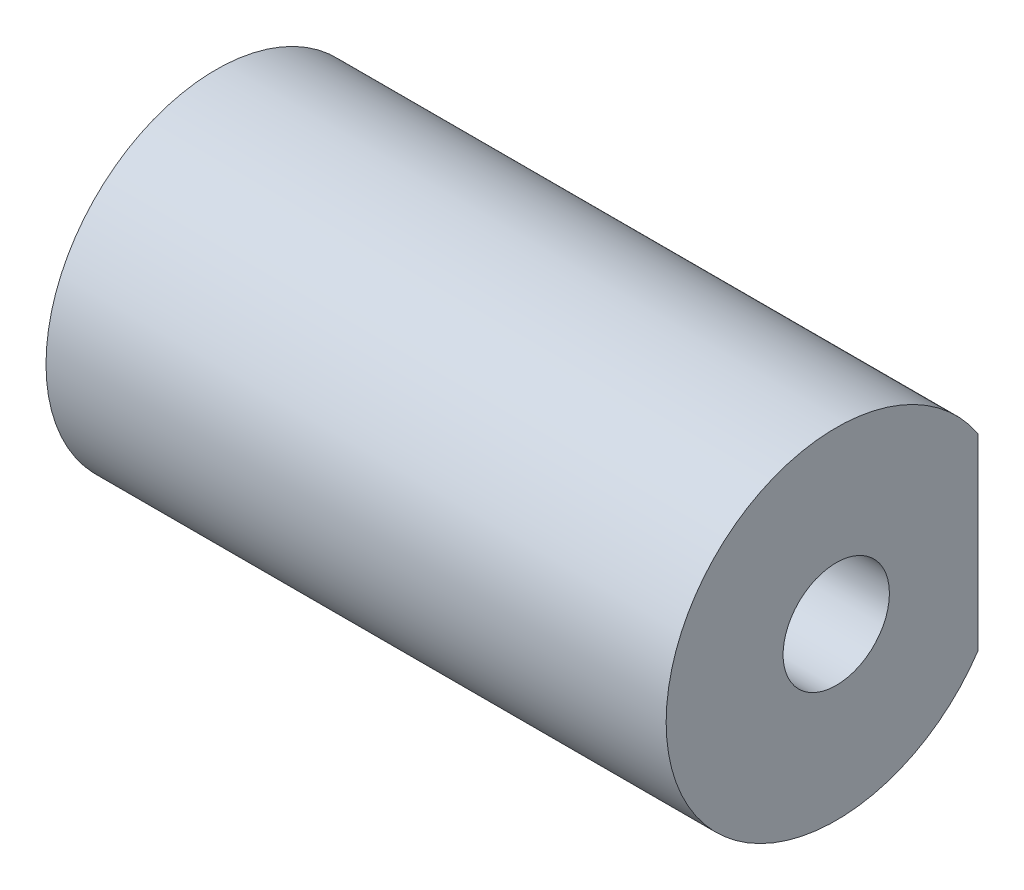
ISO-10303-21;
HEADER;
FILE_DESCRIPTION(('STEP AP214'),'2;1');
FILE_NAME('part.step','',(''),(''),'','','');
FILE_SCHEMA(('AUTOMOTIVE_DESIGN { 1 0 10303 214 1 1 1 1 }'));
ENDSEC;
DATA;
#1=APPLICATION_CONTEXT('core data for automotive mechanical design processes');
#2=APPLICATION_PROTOCOL_DEFINITION('international standard','automotive_design',2000,#1);
#3=PRODUCT_CONTEXT('',#1,'mechanical');
#4=PRODUCT('Part','Part','',(#3));
#5=PRODUCT_RELATED_PRODUCT_CATEGORY('part','',(#4));
#6=PRODUCT_DEFINITION_FORMATION('','',#4);
#7=PRODUCT_DEFINITION_CONTEXT('part definition',#1,'design');
#8=PRODUCT_DEFINITION('design','',#6,#7);
#9=PRODUCT_DEFINITION_SHAPE('','',#8);
#10=(LENGTH_UNIT() NAMED_UNIT(*) SI_UNIT(.MILLI.,.METRE.));
#11=(NAMED_UNIT(*) PLANE_ANGLE_UNIT() SI_UNIT($,.RADIAN.));
#12=(NAMED_UNIT(*) SI_UNIT($,.STERADIAN.) SOLID_ANGLE_UNIT());
#13=UNCERTAINTY_MEASURE_WITH_UNIT(LENGTH_MEASURE(1.E-05),#10,'distance_accuracy_value','');
#14=(GEOMETRIC_REPRESENTATION_CONTEXT(3) GLOBAL_UNCERTAINTY_ASSIGNED_CONTEXT((#13)) GLOBAL_UNIT_ASSIGNED_CONTEXT((#10,
#11,#12)) REPRESENTATION_CONTEXT('',''));
#15=CARTESIAN_POINT('',(0.,0.,0.));
#16=DIRECTION('',(0.,0.,1.));
#17=DIRECTION('',(1.,0.,0.));
#18=AXIS2_PLACEMENT_3D('',#15,#16,#17);
#19=CARTESIAN_POINT('',(17.5,0.,0.));
#20=DIRECTION('',(1.,0.,0.));
#21=DIRECTION('',(0.,0.,-1.));
#22=AXIS2_PLACEMENT_3D('',#19,#20,#21);
#23=PLANE('',#22);
#24=DIRECTION('',(0.,-1.,0.));
#25=VECTOR('',#24,1.);
#26=CARTESIAN_POINT('',(17.5,7.17405726897624,-4.));
#27=LINE('',#26,#25);
#28=CARTESIAN_POINT('',(17.5,2.65329983228432,-4.));
#29=VERTEX_POINT('',#28);
#30=CARTESIAN_POINT('',(17.5,-2.65329983228432,-4.));
#31=VERTEX_POINT('',#30);
#32=EDGE_CURVE('E48',#29,#31,#27,.T.);
#33=ORIENTED_EDGE('',*,*,#32,.F.);
#34=CARTESIAN_POINT('',(17.5,0.,0.));
#35=DIRECTION('',(1.,0.,0.));
#36=DIRECTION('',(0.,0.,-1.));
#37=AXIS2_PLACEMENT_3D('',#34,#35,#36);
#38=CIRCLE('',#37,4.8);
#39=EDGE_CURVE('E65',#29,#31,#38,.T.);
#40=ORIENTED_EDGE('',*,*,#39,.T.);
#41=EDGE_LOOP('',(#33,#40));
#42=FACE_BOUND('',#41,.T.);
#43=CARTESIAN_POINT('',(17.5,0.,0.));
#44=DIRECTION('',(1.,0.,0.));
#45=DIRECTION('',(0.,0.,-1.));
#46=AXIS2_PLACEMENT_3D('',#43,#44,#45);
#47=CIRCLE('',#46,1.5);
#48=CARTESIAN_POINT('',(17.5,0.,-1.5));
#49=VERTEX_POINT('',#48);
#50=EDGE_CURVE('E69',#49,#49,#47,.T.);
#51=ORIENTED_EDGE('',*,*,#50,.F.);
#52=EDGE_LOOP('',(#51));
#53=FACE_BOUND('',#52,.T.);
#54=ADVANCED_FACE('F33',(#42,#53),#23,.T.);
#55=CARTESIAN_POINT('',(0.,0.,0.));
#56=DIRECTION('',(1.,0.,0.));
#57=DIRECTION('',(0.,0.,-1.));
#58=AXIS2_PLACEMENT_3D('',#55,#56,#57);
#59=PLANE('',#58);
#60=CARTESIAN_POINT('',(0.,0.,0.));
#61=DIRECTION('',(1.,0.,0.));
#62=DIRECTION('',(0.,0.,-1.));
#63=AXIS2_PLACEMENT_3D('',#60,#61,#62);
#64=CIRCLE('',#63,4.8);
#65=CARTESIAN_POINT('',(0.,2.65329983228432,-4.));
#66=VERTEX_POINT('',#65);
#67=CARTESIAN_POINT('',(0.,-2.65329983228432,-4.));
#68=VERTEX_POINT('',#67);
#69=EDGE_CURVE('E67',#66,#68,#64,.T.);
#70=ORIENTED_EDGE('',*,*,#69,.F.);
#71=DIRECTION('',(0.,-1.,0.));
#72=VECTOR('',#71,1.);
#73=CARTESIAN_POINT('',(0.,7.17405726897624,-4.));
#74=LINE('',#73,#72);
#75=EDGE_CURVE('E57',#66,#68,#74,.T.);
#76=ORIENTED_EDGE('',*,*,#75,.T.);
#77=EDGE_LOOP('',(#70,#76));
#78=FACE_BOUND('',#77,.T.);
#79=CARTESIAN_POINT('',(0.,0.,0.));
#80=DIRECTION('',(1.,0.,0.));
#81=DIRECTION('',(0.,0.,-1.));
#82=AXIS2_PLACEMENT_3D('',#79,#80,#81);
#83=CIRCLE('',#82,1.5);
#84=CARTESIAN_POINT('',(0.,0.,-1.5));
#85=VERTEX_POINT('',#84);
#86=EDGE_CURVE('E72',#85,#85,#83,.T.);
#87=ORIENTED_EDGE('',*,*,#86,.T.);
#88=EDGE_LOOP('',(#87));
#89=FACE_BOUND('',#88,.T.);
#90=ADVANCED_FACE('F78',(#78,#89),#59,.F.);
#91=CARTESIAN_POINT('',(17.5,0.,0.));
#92=DIRECTION('',(-1.,0.,0.));
#93=DIRECTION('',(0.,0.,1.));
#94=AXIS2_PLACEMENT_3D('',#91,#92,#93);
#95=CYLINDRICAL_SURFACE('',#94,4.8);
#96=ORIENTED_EDGE('',*,*,#39,.F.);
#97=DIRECTION('',(-1.,0.,0.));
#98=VECTOR('',#97,1.);
#99=CARTESIAN_POINT('',(17.5,2.65329983228432,-4.));
#100=LINE('',#99,#98);
#101=EDGE_CURVE('E11',#29,#66,#100,.T.);
#102=ORIENTED_EDGE('',*,*,#101,.T.);
#103=ORIENTED_EDGE('',*,*,#69,.T.);
#104=DIRECTION('',(-1.,0.,0.));
#105=VECTOR('',#104,1.);
#106=CARTESIAN_POINT('',(17.5,-2.65329983228432,-4.));
#107=LINE('',#106,#105);
#108=EDGE_CURVE('E41',#68,#31,#107,.F.);
#109=ORIENTED_EDGE('',*,*,#108,.T.);
#110=EDGE_LOOP('',(#96,#102,#103,#109));
#111=FACE_BOUND('',#110,.T.);
#112=ADVANCED_FACE('F35',(#111),#95,.T.);
#113=CARTESIAN_POINT('',(17.5,0.,0.));
#114=DIRECTION('',(-1.,0.,0.));
#115=DIRECTION('',(0.,0.,1.));
#116=AXIS2_PLACEMENT_3D('',#113,#114,#115);
#117=CYLINDRICAL_SURFACE('',#116,1.5);
#118=ORIENTED_EDGE('',*,*,#50,.T.);
#119=EDGE_LOOP('',(#118));
#120=FACE_BOUND('',#119,.T.);
#121=ORIENTED_EDGE('',*,*,#86,.F.);
#122=EDGE_LOOP('',(#121));
#123=FACE_BOUND('',#122,.T.);
#124=ADVANCED_FACE('F83',(#120,#123),#117,.F.);
#125=CARTESIAN_POINT('',(0.,7.17405726897624,-4.));
#126=DIRECTION('',(0.,0.,1.));
#127=DIRECTION('',(0.,-1.,0.));
#128=AXIS2_PLACEMENT_3D('',#125,#126,#127);
#129=PLANE('',#128);
#130=ORIENTED_EDGE('',*,*,#32,.T.);
#131=ORIENTED_EDGE('',*,*,#108,.F.);
#132=ORIENTED_EDGE('',*,*,#75,.F.);
#133=ORIENTED_EDGE('',*,*,#101,.F.);
#134=EDGE_LOOP('',(#130,#131,#132,#133));
#135=FACE_BOUND('',#134,.T.);
#136=ADVANCED_FACE('F56',(#135),#129,.F.);
#137=CLOSED_SHELL('',(#54,#90,#112,#124,#136));
#138=MANIFOLD_SOLID_BREP('B2',#137);
#139=ADVANCED_BREP_SHAPE_REPRESENTATION('',(#18,#138),#14);
#140=SHAPE_DEFINITION_REPRESENTATION(#9,#139);
ENDSEC;
END-ISO-10303-21;
